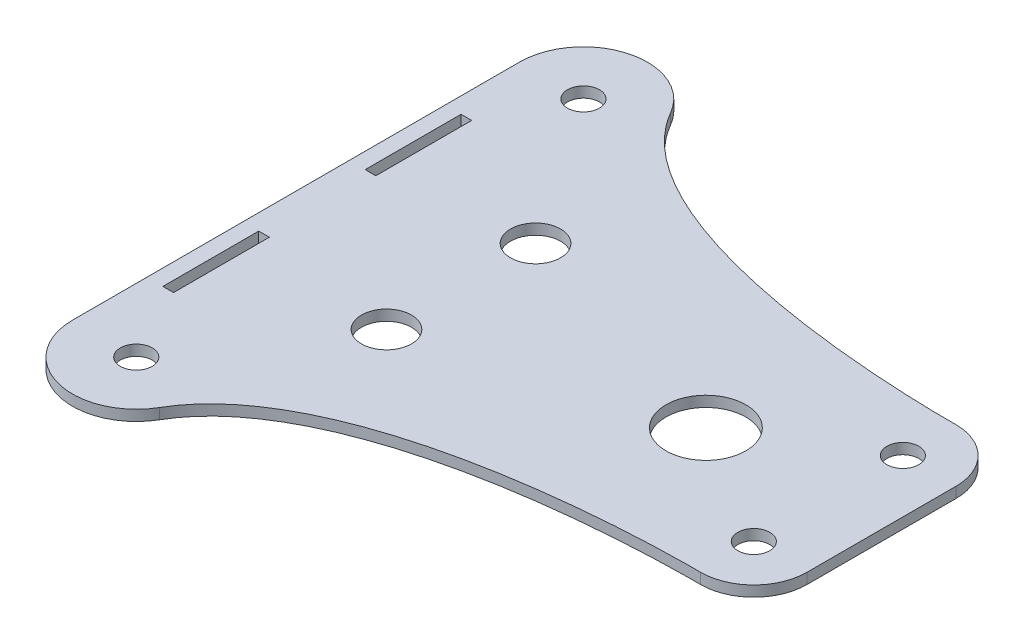
ISO-10303-21;
HEADER;
FILE_DESCRIPTION(('STEP AP214'),'2;1');
FILE_NAME('part.step','',(''),(''),'','','');
FILE_SCHEMA(('AUTOMOTIVE_DESIGN { 1 0 10303 214 1 1 1 1 }'));
ENDSEC;
DATA;
#1=APPLICATION_CONTEXT('core data for automotive mechanical design processes');
#2=APPLICATION_PROTOCOL_DEFINITION('international standard','automotive_design',2000,#1);
#3=PRODUCT_CONTEXT('',#1,'mechanical');
#4=PRODUCT('Part','Part','',(#3));
#5=PRODUCT_RELATED_PRODUCT_CATEGORY('part','',(#4));
#6=PRODUCT_DEFINITION_FORMATION('','',#4);
#7=PRODUCT_DEFINITION_CONTEXT('part definition',#1,'design');
#8=PRODUCT_DEFINITION('design','',#6,#7);
#9=PRODUCT_DEFINITION_SHAPE('','',#8);
#10=(LENGTH_UNIT() NAMED_UNIT(*) SI_UNIT(.MILLI.,.METRE.));
#11=(NAMED_UNIT(*) PLANE_ANGLE_UNIT() SI_UNIT($,.RADIAN.));
#12=(NAMED_UNIT(*) SI_UNIT($,.STERADIAN.) SOLID_ANGLE_UNIT());
#13=UNCERTAINTY_MEASURE_WITH_UNIT(LENGTH_MEASURE(1.E-05),#10,'distance_accuracy_value','');
#14=(GEOMETRIC_REPRESENTATION_CONTEXT(3) GLOBAL_UNCERTAINTY_ASSIGNED_CONTEXT((#13)) GLOBAL_UNIT_ASSIGNED_CONTEXT((#10,
#11,#12)) REPRESENTATION_CONTEXT('',''));
#15=CARTESIAN_POINT('',(0.,0.,0.));
#16=DIRECTION('',(0.,0.,1.));
#17=DIRECTION('',(1.,0.,0.));
#18=AXIS2_PLACEMENT_3D('',#15,#16,#17);
#19=CARTESIAN_POINT('',(353.145171412631,10.,-402.766363167062));
#20=DIRECTION('',(0.,-1.,0.));
#21=DIRECTION('',(0.,0.,-1.));
#22=AXIS2_PLACEMENT_3D('',#19,#20,#21);
#23=PLANE('',#22);
#24=DIRECTION('',(0.,0.,-1.));
#25=VECTOR('',#24,1.);
#26=CARTESIAN_POINT('',(44.9999999999999,10.,-410.));
#27=LINE('',#26,#25);
#28=CARTESIAN_POINT('',(44.9999999999999,10.,-320.));
#29=VERTEX_POINT('',#28);
#30=CARTESIAN_POINT('',(44.9999999999999,10.,-410.));
#31=VERTEX_POINT('',#30);
#32=EDGE_CURVE('E174',#29,#31,#27,.T.);
#33=ORIENTED_EDGE('',*,*,#32,.F.);
#34=DIRECTION('',(1.,0.,0.));
#35=VECTOR('',#34,1.);
#36=CARTESIAN_POINT('',(44.9999999999999,10.,-320.));
#37=LINE('',#36,#35);
#38=CARTESIAN_POINT('',(34.9999999999999,10.,-320.));
#39=VERTEX_POINT('',#38);
#40=EDGE_CURVE('E49',#39,#29,#37,.T.);
#41=ORIENTED_EDGE('',*,*,#40,.F.);
#42=DIRECTION('',(0.,0.,1.));
#43=VECTOR('',#42,1.);
#44=CARTESIAN_POINT('',(34.9999999999999,10.,-320.));
#45=LINE('',#44,#43);
#46=CARTESIAN_POINT('',(34.9999999999999,10.,-410.));
#47=VERTEX_POINT('',#46);
#48=EDGE_CURVE('E165',#47,#39,#45,.T.);
#49=ORIENTED_EDGE('',*,*,#48,.F.);
#50=DIRECTION('',(-1.,0.,0.));
#51=VECTOR('',#50,1.);
#52=CARTESIAN_POINT('',(34.9999999999999,10.,-410.));
#53=LINE('',#52,#51);
#54=EDGE_CURVE('E168',#31,#47,#53,.T.);
#55=ORIENTED_EDGE('',*,*,#54,.F.);
#56=EDGE_LOOP('',(#33,#41,#49,#55));
#57=FACE_BOUND('',#56,.T.);
#58=DIRECTION('',(1.,0.,0.));
#59=VECTOR('',#58,1.);
#60=CARTESIAN_POINT('',(34.9999999999999,10.,-130.));
#61=LINE('',#60,#59);
#62=CARTESIAN_POINT('',(34.9999999999999,10.,-130.));
#63=VERTEX_POINT('',#62);
#64=CARTESIAN_POINT('',(44.9999999999999,10.,-130.));
#65=VERTEX_POINT('',#64);
#66=EDGE_CURVE('E199',#63,#65,#61,.T.);
#67=ORIENTED_EDGE('',*,*,#66,.F.);
#68=DIRECTION('',(0.,0.,1.));
#69=VECTOR('',#68,1.);
#70=CARTESIAN_POINT('',(34.9999999999999,10.,-220.));
#71=LINE('',#70,#69);
#72=CARTESIAN_POINT('',(34.9999999999999,10.,-220.));
#73=VERTEX_POINT('',#72);
#74=EDGE_CURVE('E180',#73,#63,#71,.T.);
#75=ORIENTED_EDGE('',*,*,#74,.F.);
#76=DIRECTION('',(-1.,0.,0.));
#77=VECTOR('',#76,1.);
#78=CARTESIAN_POINT('',(44.9999999999999,10.,-220.));
#79=LINE('',#78,#77);
#80=CARTESIAN_POINT('',(44.9999999999999,10.,-220.));
#81=VERTEX_POINT('',#80);
#82=EDGE_CURVE('E188',#81,#73,#79,.T.);
#83=ORIENTED_EDGE('',*,*,#82,.F.);
#84=DIRECTION('',(0.,0.,-1.));
#85=VECTOR('',#84,1.);
#86=CARTESIAN_POINT('',(44.9999999999999,10.,-130.));
#87=LINE('',#86,#85);
#88=EDGE_CURVE('E202',#65,#81,#87,.T.);
#89=ORIENTED_EDGE('',*,*,#88,.F.);
#90=EDGE_LOOP('',(#67,#75,#83,#89));
#91=FACE_BOUND('',#90,.T.);
#92=CARTESIAN_POINT('',(175.,10.,-340.));
#93=DIRECTION('',(0.,1.,0.));
#94=DIRECTION('',(0.,0.,1.));
#95=AXIS2_PLACEMENT_3D('',#92,#93,#94);
#96=CIRCLE('',#95,23.5);
#97=CARTESIAN_POINT('',(175.,10.,-316.5));
#98=VERTEX_POINT('',#97);
#99=EDGE_CURVE('E222',#98,#98,#96,.T.);
#100=ORIENTED_EDGE('',*,*,#99,.F.);
#101=EDGE_LOOP('',(#100));
#102=FACE_BOUND('',#101,.T.);
#103=CARTESIAN_POINT('',(80.,10.,-480.));
#104=DIRECTION('',(0.,1.,0.));
#105=DIRECTION('',(0.,0.,1.));
#106=AXIS2_PLACEMENT_3D('',#103,#104,#105);
#107=CIRCLE('',#106,15.);
#108=CARTESIAN_POINT('',(80.,10.,-465.));
#109=VERTEX_POINT('',#108);
#110=EDGE_CURVE('E234',#109,#109,#107,.T.);
#111=ORIENTED_EDGE('',*,*,#110,.F.);
#112=EDGE_LOOP('',(#111));
#113=FACE_BOUND('',#112,.T.);
#114=CARTESIAN_POINT('',(520.,10.,-200.));
#115=DIRECTION('',(0.,1.,0.));
#116=DIRECTION('',(0.,0.,1.));
#117=AXIS2_PLACEMENT_3D('',#114,#115,#116);
#118=CIRCLE('',#117,15.0000000000001);
#119=CARTESIAN_POINT('',(520.,10.,-185.));
#120=VERTEX_POINT('',#119);
#121=EDGE_CURVE('E246',#120,#120,#118,.T.);
#122=ORIENTED_EDGE('',*,*,#121,.F.);
#123=EDGE_LOOP('',(#122));
#124=FACE_BOUND('',#123,.T.);
#125=CARTESIAN_POINT('',(520.,10.,-390.));
#126=CARTESIAN_POINT('',(519.671151051004,10.,-390.08025036953));
#127=CARTESIAN_POINT('',(204.728797973656,10.,-383.963384742635));
#128=CARTESIAN_POINT('',(131.961524227066,10.,-510.));
#129=B_SPLINE_CURVE_WITH_KNOTS('',3,(#125,#126,#127,#128),.UNSPECIFIED.,.F.,.F.,(4,4),(0.,1.),.UNSPECIFIED.);
#130=CARTESIAN_POINT('',(520.,10.,-390.));
#131=VERTEX_POINT('',#130);
#132=CARTESIAN_POINT('',(131.961524227066,10.,-510.));
#133=VERTEX_POINT('',#132);
#134=EDGE_CURVE('E257',#131,#133,#129,.T.);
#135=ORIENTED_EDGE('',*,*,#134,.T.);
#136=CARTESIAN_POINT('',(80.,10.,-480.));
#137=DIRECTION('',(0.,1.,0.));
#138=DIRECTION('',(0.,0.,1.));
#139=AXIS2_PLACEMENT_3D('',#136,#137,#138);
#140=CIRCLE('',#139,60.);
#141=CARTESIAN_POINT('',(20.,10.,-480.));
#142=VERTEX_POINT('',#141);
#143=EDGE_CURVE('E263',#133,#142,#140,.T.);
#144=ORIENTED_EDGE('',*,*,#143,.T.);
#145=DIRECTION('',(0.,0.,1.));
#146=VECTOR('',#145,1.);
#147=CARTESIAN_POINT('',(20.,10.,-480.));
#148=LINE('',#147,#146);
#149=CARTESIAN_POINT('',(19.9999999999999,10.,-60.));
#150=VERTEX_POINT('',#149);
#151=EDGE_CURVE('E269',#142,#150,#148,.T.);
#152=ORIENTED_EDGE('',*,*,#151,.T.);
#153=CARTESIAN_POINT('',(80.,10.,-60.));
#154=DIRECTION('',(0.,1.,0.));
#155=DIRECTION('',(0.,0.,1.));
#156=AXIS2_PLACEMENT_3D('',#153,#154,#155);
#157=CIRCLE('',#156,60.);
#158=CARTESIAN_POINT('',(131.961524227066,10.,-29.9999999999999));
#159=VERTEX_POINT('',#158);
#160=EDGE_CURVE('E271',#150,#159,#157,.T.);
#161=ORIENTED_EDGE('',*,*,#160,.T.);
#162=CARTESIAN_POINT('',(131.961524227066,10.,-29.9999999999999));
#163=CARTESIAN_POINT('',(204.728797973656,10.,-156.036615257365));
#164=CARTESIAN_POINT('',(519.671151051004,10.,-149.919749630471));
#165=CARTESIAN_POINT('',(520.,10.,-150.));
#166=B_SPLINE_CURVE_WITH_KNOTS('',3,(#162,#163,#164,#165),.UNSPECIFIED.,.F.,.F.,(4,4),(0.,1.),.UNSPECIFIED.);
#167=CARTESIAN_POINT('',(520.,10.,-150.));
#168=VERTEX_POINT('',#167);
#169=EDGE_CURVE('E273',#159,#168,#166,.T.);
#170=ORIENTED_EDGE('',*,*,#169,.T.);
#171=CARTESIAN_POINT('',(520.,10.,-200.));
#172=DIRECTION('',(0.,1.,0.));
#173=DIRECTION('',(0.,0.,1.));
#174=AXIS2_PLACEMENT_3D('',#171,#172,#173);
#175=CIRCLE('',#174,50.);
#176=CARTESIAN_POINT('',(570.,10.,-200.));
#177=VERTEX_POINT('',#176);
#178=EDGE_CURVE('E278',#168,#177,#175,.T.);
#179=ORIENTED_EDGE('',*,*,#178,.T.);
#180=DIRECTION('',(0.,0.,-1.));
#181=VECTOR('',#180,1.);
#182=CARTESIAN_POINT('',(570.,10.,-340.));
#183=LINE('',#182,#181);
#184=CARTESIAN_POINT('',(570.,10.,-340.));
#185=VERTEX_POINT('',#184);
#186=EDGE_CURVE('E399',#177,#185,#183,.T.);
#187=ORIENTED_EDGE('',*,*,#186,.T.);
#188=CARTESIAN_POINT('',(520.,10.,-340.));
#189=DIRECTION('',(0.,1.,0.));
#190=DIRECTION('',(0.,0.,-1.));
#191=AXIS2_PLACEMENT_3D('',#188,#189,#190);
#192=CIRCLE('',#191,50.);
#193=EDGE_CURVE('E344',#185,#131,#192,.T.);
#194=ORIENTED_EDGE('',*,*,#193,.T.);
#195=EDGE_LOOP('',(#135,#144,#152,#161,#170,#179,#187,#194));
#196=FACE_BOUND('',#195,.T.);
#197=CARTESIAN_POINT('',(405.,10.,-270.));
#198=DIRECTION('',(0.,1.,0.));
#199=DIRECTION('',(0.,0.,1.));
#200=AXIS2_PLACEMENT_3D('',#197,#198,#199);
#201=CIRCLE('',#200,37.5);
#202=CARTESIAN_POINT('',(405.,10.,-232.5));
#203=VERTEX_POINT('',#202);
#204=EDGE_CURVE('E252',#203,#203,#201,.T.);
#205=ORIENTED_EDGE('',*,*,#204,.F.);
#206=EDGE_LOOP('',(#205));
#207=FACE_BOUND('',#206,.T.);
#208=CARTESIAN_POINT('',(520.,10.,-340.));
#209=DIRECTION('',(0.,1.,0.));
#210=DIRECTION('',(0.,0.,1.));
#211=AXIS2_PLACEMENT_3D('',#208,#209,#210);
#212=CIRCLE('',#211,15.);
#213=CARTESIAN_POINT('',(520.,10.,-325.));
#214=VERTEX_POINT('',#213);
#215=EDGE_CURVE('E240',#214,#214,#212,.T.);
#216=ORIENTED_EDGE('',*,*,#215,.F.);
#217=EDGE_LOOP('',(#216));
#218=FACE_BOUND('',#217,.T.);
#219=CARTESIAN_POINT('',(80.,10.,-60.));
#220=DIRECTION('',(0.,1.,0.));
#221=DIRECTION('',(0.,0.,1.));
#222=AXIS2_PLACEMENT_3D('',#219,#220,#221);
#223=CIRCLE('',#222,15.);
#224=CARTESIAN_POINT('',(80.,10.,-45.));
#225=VERTEX_POINT('',#224);
#226=EDGE_CURVE('E228',#225,#225,#223,.T.);
#227=ORIENTED_EDGE('',*,*,#226,.F.);
#228=EDGE_LOOP('',(#227));
#229=FACE_BOUND('',#228,.T.);
#230=CARTESIAN_POINT('',(175.,10.,-200.));
#231=DIRECTION('',(0.,1.,0.));
#232=DIRECTION('',(0.,0.,1.));
#233=AXIS2_PLACEMENT_3D('',#230,#231,#232);
#234=CIRCLE('',#233,23.5);
#235=CARTESIAN_POINT('',(175.,10.,-176.5));
#236=VERTEX_POINT('',#235);
#237=EDGE_CURVE('E216',#236,#236,#234,.T.);
#238=ORIENTED_EDGE('',*,*,#237,.F.);
#239=EDGE_LOOP('',(#238));
#240=FACE_BOUND('',#239,.T.);
#241=ADVANCED_FACE('F33',(#57,#91,#102,#113,#124,#196,#207,#218,#229,#240),#23,.F.);
#242=CARTESIAN_POINT('',(353.145171412631,0.,-402.766363167062));
#243=DIRECTION('',(0.,-1.,0.));
#244=DIRECTION('',(0.,0.,-1.));
#245=AXIS2_PLACEMENT_3D('',#242,#243,#244);
#246=PLANE('',#245);
#247=DIRECTION('',(1.,0.,0.));
#248=VECTOR('',#247,1.);
#249=CARTESIAN_POINT('',(44.9999999999999,0.,-320.));
#250=LINE('',#249,#248);
#251=CARTESIAN_POINT('',(34.9999999999999,0.,-320.));
#252=VERTEX_POINT('',#251);
#253=CARTESIAN_POINT('',(44.9999999999999,0.,-320.));
#254=VERTEX_POINT('',#253);
#255=EDGE_CURVE('E149',#252,#254,#250,.T.);
#256=ORIENTED_EDGE('',*,*,#255,.T.);
#257=DIRECTION('',(0.,0.,-1.));
#258=VECTOR('',#257,1.);
#259=CARTESIAN_POINT('',(44.9999999999999,0.,-410.));
#260=LINE('',#259,#258);
#261=CARTESIAN_POINT('',(44.9999999999999,0.,-410.));
#262=VERTEX_POINT('',#261);
#263=EDGE_CURVE('E158',#254,#262,#260,.T.);
#264=ORIENTED_EDGE('',*,*,#263,.T.);
#265=DIRECTION('',(-1.,0.,0.));
#266=VECTOR('',#265,1.);
#267=CARTESIAN_POINT('',(34.9999999999999,0.,-410.));
#268=LINE('',#267,#266);
#269=CARTESIAN_POINT('',(34.9999999999999,0.,-410.));
#270=VERTEX_POINT('',#269);
#271=EDGE_CURVE('E57',#262,#270,#268,.T.);
#272=ORIENTED_EDGE('',*,*,#271,.T.);
#273=DIRECTION('',(0.,0.,1.));
#274=VECTOR('',#273,1.);
#275=CARTESIAN_POINT('',(34.9999999999999,0.,-320.));
#276=LINE('',#275,#274);
#277=EDGE_CURVE('E155',#270,#252,#276,.T.);
#278=ORIENTED_EDGE('',*,*,#277,.T.);
#279=EDGE_LOOP('',(#256,#264,#272,#278));
#280=FACE_BOUND('',#279,.T.);
#281=DIRECTION('',(0.,0.,1.));
#282=VECTOR('',#281,1.);
#283=CARTESIAN_POINT('',(34.9999999999999,0.,-220.));
#284=LINE('',#283,#282);
#285=CARTESIAN_POINT('',(34.9999999999999,0.,-220.));
#286=VERTEX_POINT('',#285);
#287=CARTESIAN_POINT('',(34.9999999999999,0.,-130.));
#288=VERTEX_POINT('',#287);
#289=EDGE_CURVE('E184',#286,#288,#284,.T.);
#290=ORIENTED_EDGE('',*,*,#289,.T.);
#291=DIRECTION('',(1.,0.,0.));
#292=VECTOR('',#291,1.);
#293=CARTESIAN_POINT('',(34.9999999999999,0.,-130.));
#294=LINE('',#293,#292);
#295=CARTESIAN_POINT('',(45.,0.,-130.));
#296=VERTEX_POINT('',#295);
#297=EDGE_CURVE('E187',#288,#296,#294,.T.);
#298=ORIENTED_EDGE('',*,*,#297,.T.);
#299=DIRECTION('',(0.,0.,-1.));
#300=VECTOR('',#299,1.);
#301=CARTESIAN_POINT('',(44.9999999999999,0.,-130.));
#302=LINE('',#301,#300);
#303=CARTESIAN_POINT('',(44.9999999999999,0.,-220.));
#304=VERTEX_POINT('',#303);
#305=EDGE_CURVE('E191',#296,#304,#302,.T.);
#306=ORIENTED_EDGE('',*,*,#305,.T.);
#307=DIRECTION('',(-1.,0.,0.));
#308=VECTOR('',#307,1.);
#309=CARTESIAN_POINT('',(44.9999999999999,0.,-220.));
#310=LINE('',#309,#308);
#311=EDGE_CURVE('E194',#304,#286,#310,.T.);
#312=ORIENTED_EDGE('',*,*,#311,.T.);
#313=EDGE_LOOP('',(#290,#298,#306,#312));
#314=FACE_BOUND('',#313,.T.);
#315=CARTESIAN_POINT('',(175.,0.,-340.));
#316=DIRECTION('',(0.,1.,0.));
#317=DIRECTION('',(0.,0.,1.));
#318=AXIS2_PLACEMENT_3D('',#315,#316,#317);
#319=CIRCLE('',#318,23.5);
#320=CARTESIAN_POINT('',(175.,0.,-316.5));
#321=VERTEX_POINT('',#320);
#322=EDGE_CURVE('E219',#321,#321,#319,.T.);
#323=ORIENTED_EDGE('',*,*,#322,.T.);
#324=EDGE_LOOP('',(#323));
#325=FACE_BOUND('',#324,.T.);
#326=CARTESIAN_POINT('',(80.,0.,-480.));
#327=DIRECTION('',(0.,1.,0.));
#328=DIRECTION('',(0.,0.,1.));
#329=AXIS2_PLACEMENT_3D('',#326,#327,#328);
#330=CIRCLE('',#329,15.);
#331=CARTESIAN_POINT('',(80.,0.,-465.));
#332=VERTEX_POINT('',#331);
#333=EDGE_CURVE('E231',#332,#332,#330,.T.);
#334=ORIENTED_EDGE('',*,*,#333,.T.);
#335=EDGE_LOOP('',(#334));
#336=FACE_BOUND('',#335,.T.);
#337=CARTESIAN_POINT('',(520.,0.,-200.));
#338=DIRECTION('',(0.,1.,0.));
#339=DIRECTION('',(0.,0.,1.));
#340=AXIS2_PLACEMENT_3D('',#337,#338,#339);
#341=CIRCLE('',#340,15.0000000000001);
#342=CARTESIAN_POINT('',(520.,0.,-185.));
#343=VERTEX_POINT('',#342);
#344=EDGE_CURVE('E243',#343,#343,#341,.T.);
#345=ORIENTED_EDGE('',*,*,#344,.T.);
#346=EDGE_LOOP('',(#345));
#347=FACE_BOUND('',#346,.T.);
#348=CARTESIAN_POINT('',(520.,0.,-390.));
#349=CARTESIAN_POINT('',(519.671151051004,0.,-390.08025036953));
#350=CARTESIAN_POINT('',(204.728797973656,0.,-383.963384742635));
#351=CARTESIAN_POINT('',(131.961524227066,0.,-510.));
#352=B_SPLINE_CURVE_WITH_KNOTS('',3,(#348,#349,#350,#351),.UNSPECIFIED.,.F.,.F.,(4,4),(0.,1.),.UNSPECIFIED.);
#353=CARTESIAN_POINT('',(520.,0.,-390.));
#354=VERTEX_POINT('',#353);
#355=CARTESIAN_POINT('',(131.961524227066,0.,-510.));
#356=VERTEX_POINT('',#355);
#357=EDGE_CURVE('E255',#354,#356,#352,.T.);
#358=ORIENTED_EDGE('',*,*,#357,.F.);
#359=CARTESIAN_POINT('',(520.,0.,-340.));
#360=DIRECTION('',(0.,1.,0.));
#361=DIRECTION('',(0.,0.,-1.));
#362=AXIS2_PLACEMENT_3D('',#359,#360,#361);
#363=CIRCLE('',#362,50.);
#364=CARTESIAN_POINT('',(570.,0.,-340.));
#365=VERTEX_POINT('',#364);
#366=EDGE_CURVE('E264',#365,#354,#363,.T.);
#367=ORIENTED_EDGE('',*,*,#366,.F.);
#368=DIRECTION('',(0.,0.,-1.));
#369=VECTOR('',#368,1.);
#370=CARTESIAN_POINT('',(570.,0.,-340.));
#371=LINE('',#370,#369);
#372=CARTESIAN_POINT('',(570.,0.,-200.));
#373=VERTEX_POINT('',#372);
#374=EDGE_CURVE('E330',#373,#365,#371,.T.);
#375=ORIENTED_EDGE('',*,*,#374,.F.);
#376=CARTESIAN_POINT('',(520.,0.,-200.));
#377=DIRECTION('',(0.,1.,0.));
#378=DIRECTION('',(0.,0.,1.));
#379=AXIS2_PLACEMENT_3D('',#376,#377,#378);
#380=CIRCLE('',#379,50.);
#381=CARTESIAN_POINT('',(520.,0.,-150.));
#382=VERTEX_POINT('',#381);
#383=EDGE_CURVE('E340',#382,#373,#380,.T.);
#384=ORIENTED_EDGE('',*,*,#383,.F.);
#385=CARTESIAN_POINT('',(131.961524227066,0.,-29.9999999999999));
#386=CARTESIAN_POINT('',(204.728797973656,0.,-156.036615257365));
#387=CARTESIAN_POINT('',(519.671151051004,0.,-149.919749630471));
#388=CARTESIAN_POINT('',(520.,0.,-150.));
#389=B_SPLINE_CURVE_WITH_KNOTS('',3,(#385,#386,#387,#388),.UNSPECIFIED.,.F.,.F.,(4,4),(0.,1.),.UNSPECIFIED.);
#390=CARTESIAN_POINT('',(131.961524227066,0.,-29.9999999999999));
#391=VERTEX_POINT('',#390);
#392=EDGE_CURVE('E374',#391,#382,#389,.T.);
#393=ORIENTED_EDGE('',*,*,#392,.F.);
#394=CARTESIAN_POINT('',(80.,0.,-60.));
#395=DIRECTION('',(0.,1.,0.));
#396=DIRECTION('',(0.,0.,1.));
#397=AXIS2_PLACEMENT_3D('',#394,#395,#396);
#398=CIRCLE('',#397,60.);
#399=CARTESIAN_POINT('',(19.9999999999999,0.,-60.));
#400=VERTEX_POINT('',#399);
#401=EDGE_CURVE('E372',#400,#391,#398,.T.);
#402=ORIENTED_EDGE('',*,*,#401,.F.);
#403=DIRECTION('',(0.,0.,1.));
#404=VECTOR('',#403,1.);
#405=CARTESIAN_POINT('',(20.,0.,-480.));
#406=LINE('',#405,#404);
#407=CARTESIAN_POINT('',(20.,0.,-480.));
#408=VERTEX_POINT('',#407);
#409=EDGE_CURVE('E368',#408,#400,#406,.T.);
#410=ORIENTED_EDGE('',*,*,#409,.F.);
#411=CARTESIAN_POINT('',(80.,0.,-480.));
#412=DIRECTION('',(0.,1.,0.));
#413=DIRECTION('',(0.,0.,1.));
#414=AXIS2_PLACEMENT_3D('',#411,#412,#413);
#415=CIRCLE('',#414,60.);
#416=EDGE_CURVE('E370',#356,#408,#415,.T.);
#417=ORIENTED_EDGE('',*,*,#416,.F.);
#418=EDGE_LOOP('',(#358,#367,#375,#384,#393,#402,#410,#417));
#419=FACE_BOUND('',#418,.T.);
#420=CARTESIAN_POINT('',(405.,0.,-270.));
#421=DIRECTION('',(0.,1.,0.));
#422=DIRECTION('',(0.,0.,1.));
#423=AXIS2_PLACEMENT_3D('',#420,#421,#422);
#424=CIRCLE('',#423,37.5);
#425=CARTESIAN_POINT('',(405.,0.,-232.5));
#426=VERTEX_POINT('',#425);
#427=EDGE_CURVE('E249',#426,#426,#424,.T.);
#428=ORIENTED_EDGE('',*,*,#427,.T.);
#429=EDGE_LOOP('',(#428));
#430=FACE_BOUND('',#429,.T.);
#431=CARTESIAN_POINT('',(520.,0.,-340.));
#432=DIRECTION('',(0.,1.,0.));
#433=DIRECTION('',(0.,0.,1.));
#434=AXIS2_PLACEMENT_3D('',#431,#432,#433);
#435=CIRCLE('',#434,15.);
#436=CARTESIAN_POINT('',(520.,0.,-325.));
#437=VERTEX_POINT('',#436);
#438=EDGE_CURVE('E237',#437,#437,#435,.T.);
#439=ORIENTED_EDGE('',*,*,#438,.T.);
#440=EDGE_LOOP('',(#439));
#441=FACE_BOUND('',#440,.T.);
#442=CARTESIAN_POINT('',(80.,0.,-60.));
#443=DIRECTION('',(0.,1.,0.));
#444=DIRECTION('',(0.,0.,1.));
#445=AXIS2_PLACEMENT_3D('',#442,#443,#444);
#446=CIRCLE('',#445,15.);
#447=CARTESIAN_POINT('',(80.,0.,-45.));
#448=VERTEX_POINT('',#447);
#449=EDGE_CURVE('E225',#448,#448,#446,.T.);
#450=ORIENTED_EDGE('',*,*,#449,.T.);
#451=EDGE_LOOP('',(#450));
#452=FACE_BOUND('',#451,.T.);
#453=CARTESIAN_POINT('',(175.,0.,-200.));
#454=DIRECTION('',(0.,1.,0.));
#455=DIRECTION('',(0.,0.,1.));
#456=AXIS2_PLACEMENT_3D('',#453,#454,#455);
#457=CIRCLE('',#456,23.5);
#458=CARTESIAN_POINT('',(175.,0.,-176.5));
#459=VERTEX_POINT('',#458);
#460=EDGE_CURVE('E209',#459,#459,#457,.T.);
#461=ORIENTED_EDGE('',*,*,#460,.T.);
#462=EDGE_LOOP('',(#461));
#463=FACE_BOUND('',#462,.T.);
#464=ADVANCED_FACE('F162',(#280,#314,#325,#336,#347,#419,#430,#441,#452,#463),#246,.T.);
#465=DIRECTION('',(0.,-1.,0.));
#466=VECTOR('',#465,1.);
#467=SURFACE_OF_LINEAR_EXTRUSION('',#129,#466);
#468=ORIENTED_EDGE('',*,*,#357,.T.);
#469=DIRECTION('',(0.,-1.,0.));
#470=VECTOR('',#469,1.);
#471=CARTESIAN_POINT('',(131.961524227066,10.,-510.));
#472=LINE('',#471,#470);
#473=EDGE_CURVE('E11',#133,#356,#472,.T.);
#474=ORIENTED_EDGE('',*,*,#473,.F.);
#475=ORIENTED_EDGE('',*,*,#134,.F.);
#476=DIRECTION('',(0.,-1.,0.));
#477=VECTOR('',#476,1.);
#478=CARTESIAN_POINT('',(520.,10.,-390.));
#479=LINE('',#478,#477);
#480=EDGE_CURVE('E345',#131,#354,#479,.T.);
#481=ORIENTED_EDGE('',*,*,#480,.T.);
#482=EDGE_LOOP('',(#468,#474,#475,#481));
#483=FACE_BOUND('',#482,.T.);
#484=ADVANCED_FACE('F35',(#483),#467,.F.);
#485=CARTESIAN_POINT('',(80.,10.,-480.));
#486=DIRECTION('',(0.,-1.,0.));
#487=DIRECTION('',(0.,0.,-1.));
#488=AXIS2_PLACEMENT_3D('',#485,#486,#487);
#489=CYLINDRICAL_SURFACE('',#488,60.);
#490=ORIENTED_EDGE('',*,*,#416,.T.);
#491=DIRECTION('',(0.,-1.,0.));
#492=VECTOR('',#491,1.);
#493=CARTESIAN_POINT('',(20.,10.,-480.));
#494=LINE('',#493,#492);
#495=EDGE_CURVE('E42',#142,#408,#494,.T.);
#496=ORIENTED_EDGE('',*,*,#495,.F.);
#497=ORIENTED_EDGE('',*,*,#143,.F.);
#498=ORIENTED_EDGE('',*,*,#473,.T.);
#499=EDGE_LOOP('',(#490,#496,#497,#498));
#500=FACE_BOUND('',#499,.T.);
#501=ADVANCED_FACE('F297',(#500),#489,.T.);
#502=CARTESIAN_POINT('',(20.,10.,-480.));
#503=DIRECTION('',(1.,0.,0.));
#504=DIRECTION('',(0.,0.,-1.));
#505=AXIS2_PLACEMENT_3D('',#502,#503,#504);
#506=PLANE('',#505);
#507=ORIENTED_EDGE('',*,*,#409,.T.);
#508=DIRECTION('',(0.,-1.,0.));
#509=VECTOR('',#508,1.);
#510=CARTESIAN_POINT('',(19.9999999999999,10.,-60.));
#511=LINE('',#510,#509);
#512=EDGE_CURVE('E361',#150,#400,#511,.T.);
#513=ORIENTED_EDGE('',*,*,#512,.F.);
#514=ORIENTED_EDGE('',*,*,#151,.F.);
#515=ORIENTED_EDGE('',*,*,#495,.T.);
#516=EDGE_LOOP('',(#507,#513,#514,#515));
#517=FACE_BOUND('',#516,.T.);
#518=ADVANCED_FACE('F294',(#517),#506,.F.);
#519=CARTESIAN_POINT('',(80.,10.,-60.));
#520=DIRECTION('',(0.,-1.,0.));
#521=DIRECTION('',(0.,0.,-1.));
#522=AXIS2_PLACEMENT_3D('',#519,#520,#521);
#523=CYLINDRICAL_SURFACE('',#522,60.);
#524=ORIENTED_EDGE('',*,*,#401,.T.);
#525=DIRECTION('',(0.,-1.,0.));
#526=VECTOR('',#525,1.);
#527=CARTESIAN_POINT('',(131.961524227066,10.,-29.9999999999999));
#528=LINE('',#527,#526);
#529=EDGE_CURVE('E358',#159,#391,#528,.T.);
#530=ORIENTED_EDGE('',*,*,#529,.F.);
#531=ORIENTED_EDGE('',*,*,#160,.F.);
#532=ORIENTED_EDGE('',*,*,#512,.T.);
#533=EDGE_LOOP('',(#524,#530,#531,#532));
#534=FACE_BOUND('',#533,.T.);
#535=ADVANCED_FACE('F289',(#534),#523,.T.);
#536=DIRECTION('',(0.,-1.,0.));
#537=VECTOR('',#536,1.);
#538=SURFACE_OF_LINEAR_EXTRUSION('',#166,#537);
#539=ORIENTED_EDGE('',*,*,#392,.T.);
#540=DIRECTION('',(0.,-1.,0.));
#541=VECTOR('',#540,1.);
#542=CARTESIAN_POINT('',(520.,10.,-150.));
#543=LINE('',#542,#541);
#544=EDGE_CURVE('E355',#168,#382,#543,.T.);
#545=ORIENTED_EDGE('',*,*,#544,.F.);
#546=ORIENTED_EDGE('',*,*,#169,.F.);
#547=ORIENTED_EDGE('',*,*,#529,.T.);
#548=EDGE_LOOP('',(#539,#545,#546,#547));
#549=FACE_BOUND('',#548,.T.);
#550=ADVANCED_FACE('F284',(#549),#538,.F.);
#551=CARTESIAN_POINT('',(520.,10.,-200.));
#552=DIRECTION('',(0.,-1.,0.));
#553=DIRECTION('',(0.,0.,-1.));
#554=AXIS2_PLACEMENT_3D('',#551,#552,#553);
#555=CYLINDRICAL_SURFACE('',#554,50.);
#556=ORIENTED_EDGE('',*,*,#383,.T.);
#557=DIRECTION('',(0.,-1.,0.));
#558=VECTOR('',#557,1.);
#559=CARTESIAN_POINT('',(570.,10.,-200.));
#560=LINE('',#559,#558);
#561=EDGE_CURVE('E336',#177,#373,#560,.T.);
#562=ORIENTED_EDGE('',*,*,#561,.F.);
#563=ORIENTED_EDGE('',*,*,#178,.F.);
#564=ORIENTED_EDGE('',*,*,#544,.T.);
#565=EDGE_LOOP('',(#556,#562,#563,#564));
#566=FACE_BOUND('',#565,.T.);
#567=ADVANCED_FACE('F288',(#566),#555,.T.);
#568=CARTESIAN_POINT('',(570.,10.,-340.));
#569=DIRECTION('',(-1.,0.,0.));
#570=DIRECTION('',(0.,0.,1.));
#571=AXIS2_PLACEMENT_3D('',#568,#569,#570);
#572=PLANE('',#571);
#573=ORIENTED_EDGE('',*,*,#374,.T.);
#574=DIRECTION('',(0.,-1.,0.));
#575=VECTOR('',#574,1.);
#576=CARTESIAN_POINT('',(570.,10.,-340.));
#577=LINE('',#576,#575);
#578=EDGE_CURVE('E333',#185,#365,#577,.T.);
#579=ORIENTED_EDGE('',*,*,#578,.F.);
#580=ORIENTED_EDGE('',*,*,#186,.F.);
#581=ORIENTED_EDGE('',*,*,#561,.T.);
#582=EDGE_LOOP('',(#573,#579,#580,#581));
#583=FACE_BOUND('',#582,.T.);
#584=ADVANCED_FACE('F319',(#583),#572,.F.);
#585=CARTESIAN_POINT('',(520.,10.,-340.));
#586=DIRECTION('',(0.,-1.,0.));
#587=DIRECTION('',(0.,0.,-1.));
#588=AXIS2_PLACEMENT_3D('',#585,#586,#587);
#589=CYLINDRICAL_SURFACE('',#588,50.);
#590=ORIENTED_EDGE('',*,*,#366,.T.);
#591=ORIENTED_EDGE('',*,*,#480,.F.);
#592=ORIENTED_EDGE('',*,*,#193,.F.);
#593=ORIENTED_EDGE('',*,*,#578,.T.);
#594=EDGE_LOOP('',(#590,#591,#592,#593));
#595=FACE_BOUND('',#594,.T.);
#596=ADVANCED_FACE('F317',(#595),#589,.T.);
#597=CARTESIAN_POINT('',(405.,10.,-270.));
#598=DIRECTION('',(0.,-1.,0.));
#599=DIRECTION('',(0.,0.,-1.));
#600=AXIS2_PLACEMENT_3D('',#597,#598,#599);
#601=CYLINDRICAL_SURFACE('',#600,37.5);
#602=ORIENTED_EDGE('',*,*,#204,.T.);
#603=EDGE_LOOP('',(#602));
#604=FACE_BOUND('',#603,.T.);
#605=ORIENTED_EDGE('',*,*,#427,.F.);
#606=EDGE_LOOP('',(#605));
#607=FACE_BOUND('',#606,.T.);
#608=ADVANCED_FACE('F314',(#604,#607),#601,.F.);
#609=CARTESIAN_POINT('',(520.,10.,-200.));
#610=DIRECTION('',(0.,-1.,0.));
#611=DIRECTION('',(0.,0.,-1.));
#612=AXIS2_PLACEMENT_3D('',#609,#610,#611);
#613=CYLINDRICAL_SURFACE('',#612,15.0000000000001);
#614=ORIENTED_EDGE('',*,*,#121,.T.);
#615=EDGE_LOOP('',(#614));
#616=FACE_BOUND('',#615,.T.);
#617=ORIENTED_EDGE('',*,*,#344,.F.);
#618=EDGE_LOOP('',(#617));
#619=FACE_BOUND('',#618,.T.);
#620=ADVANCED_FACE('F437',(#616,#619),#613,.F.);
#621=CARTESIAN_POINT('',(520.,10.,-340.));
#622=DIRECTION('',(0.,-1.,0.));
#623=DIRECTION('',(0.,0.,-1.));
#624=AXIS2_PLACEMENT_3D('',#621,#622,#623);
#625=CYLINDRICAL_SURFACE('',#624,15.);
#626=ORIENTED_EDGE('',*,*,#215,.T.);
#627=EDGE_LOOP('',(#626));
#628=FACE_BOUND('',#627,.T.);
#629=ORIENTED_EDGE('',*,*,#438,.F.);
#630=EDGE_LOOP('',(#629));
#631=FACE_BOUND('',#630,.T.);
#632=ADVANCED_FACE('F434',(#628,#631),#625,.F.);
#633=CARTESIAN_POINT('',(80.,10.,-480.));
#634=DIRECTION('',(0.,-1.,0.));
#635=DIRECTION('',(0.,0.,-1.));
#636=AXIS2_PLACEMENT_3D('',#633,#634,#635);
#637=CYLINDRICAL_SURFACE('',#636,15.);
#638=ORIENTED_EDGE('',*,*,#110,.T.);
#639=EDGE_LOOP('',(#638));
#640=FACE_BOUND('',#639,.T.);
#641=ORIENTED_EDGE('',*,*,#333,.F.);
#642=EDGE_LOOP('',(#641));
#643=FACE_BOUND('',#642,.T.);
#644=ADVANCED_FACE('F430',(#640,#643),#637,.F.);
#645=CARTESIAN_POINT('',(80.,10.,-60.));
#646=DIRECTION('',(0.,-1.,0.));
#647=DIRECTION('',(0.,0.,-1.));
#648=AXIS2_PLACEMENT_3D('',#645,#646,#647);
#649=CYLINDRICAL_SURFACE('',#648,15.);
#650=ORIENTED_EDGE('',*,*,#226,.T.);
#651=EDGE_LOOP('',(#650));
#652=FACE_BOUND('',#651,.T.);
#653=ORIENTED_EDGE('',*,*,#449,.F.);
#654=EDGE_LOOP('',(#653));
#655=FACE_BOUND('',#654,.T.);
#656=ADVANCED_FACE('F423',(#652,#655),#649,.F.);
#657=CARTESIAN_POINT('',(175.,10.,-340.));
#658=DIRECTION('',(0.,-1.,0.));
#659=DIRECTION('',(0.,0.,-1.));
#660=AXIS2_PLACEMENT_3D('',#657,#658,#659);
#661=CYLINDRICAL_SURFACE('',#660,23.5);
#662=ORIENTED_EDGE('',*,*,#99,.T.);
#663=EDGE_LOOP('',(#662));
#664=FACE_BOUND('',#663,.T.);
#665=ORIENTED_EDGE('',*,*,#322,.F.);
#666=EDGE_LOOP('',(#665));
#667=FACE_BOUND('',#666,.T.);
#668=ADVANCED_FACE('F412',(#664,#667),#661,.F.);
#669=CARTESIAN_POINT('',(175.,10.,-200.));
#670=DIRECTION('',(0.,-1.,0.));
#671=DIRECTION('',(0.,0.,-1.));
#672=AXIS2_PLACEMENT_3D('',#669,#670,#671);
#673=CYLINDRICAL_SURFACE('',#672,23.5);
#674=ORIENTED_EDGE('',*,*,#237,.T.);
#675=EDGE_LOOP('',(#674));
#676=FACE_BOUND('',#675,.T.);
#677=ORIENTED_EDGE('',*,*,#460,.F.);
#678=EDGE_LOOP('',(#677));
#679=FACE_BOUND('',#678,.T.);
#680=ADVANCED_FACE('F408',(#676,#679),#673,.F.);
#681=CARTESIAN_POINT('',(34.9999999999999,0.,-220.));
#682=DIRECTION('',(-1.,0.,0.));
#683=DIRECTION('',(0.,0.,1.));
#684=AXIS2_PLACEMENT_3D('',#681,#682,#683);
#685=PLANE('',#684);
#686=ORIENTED_EDGE('',*,*,#74,.T.);
#687=DIRECTION('',(0.,1.,0.));
#688=VECTOR('',#687,1.);
#689=CARTESIAN_POINT('',(34.9999999999999,0.,-130.));
#690=LINE('',#689,#688);
#691=EDGE_CURVE('E197',#288,#63,#690,.T.);
#692=ORIENTED_EDGE('',*,*,#691,.F.);
#693=ORIENTED_EDGE('',*,*,#289,.F.);
#694=DIRECTION('',(0.,1.,0.));
#695=VECTOR('',#694,1.);
#696=CARTESIAN_POINT('',(34.9999999999999,0.,-220.));
#697=LINE('',#696,#695);
#698=EDGE_CURVE('E207',#286,#73,#697,.T.);
#699=ORIENTED_EDGE('',*,*,#698,.T.);
#700=EDGE_LOOP('',(#686,#692,#693,#699));
#701=FACE_BOUND('',#700,.T.);
#702=ADVANCED_FACE('F411',(#701),#685,.F.);
#703=CARTESIAN_POINT('',(44.9999999999999,0.,-220.));
#704=DIRECTION('',(0.,0.,-1.));
#705=DIRECTION('',(-1.,0.,0.));
#706=AXIS2_PLACEMENT_3D('',#703,#704,#705);
#707=PLANE('',#706);
#708=ORIENTED_EDGE('',*,*,#82,.T.);
#709=ORIENTED_EDGE('',*,*,#698,.F.);
#710=ORIENTED_EDGE('',*,*,#311,.F.);
#711=DIRECTION('',(0.,1.,0.));
#712=VECTOR('',#711,1.);
#713=CARTESIAN_POINT('',(44.9999999999999,0.,-220.));
#714=LINE('',#713,#712);
#715=EDGE_CURVE('E210',#304,#81,#714,.T.);
#716=ORIENTED_EDGE('',*,*,#715,.T.);
#717=EDGE_LOOP('',(#708,#709,#710,#716));
#718=FACE_BOUND('',#717,.T.);
#719=ADVANCED_FACE('F420',(#718),#707,.F.);
#720=CARTESIAN_POINT('',(44.9999999999999,0.,-130.));
#721=DIRECTION('',(1.,0.,0.));
#722=DIRECTION('',(0.,0.,-1.));
#723=AXIS2_PLACEMENT_3D('',#720,#721,#722);
#724=PLANE('',#723);
#725=ORIENTED_EDGE('',*,*,#88,.T.);
#726=ORIENTED_EDGE('',*,*,#715,.F.);
#727=ORIENTED_EDGE('',*,*,#305,.F.);
#728=DIRECTION('',(0.,1.,0.));
#729=VECTOR('',#728,1.);
#730=CARTESIAN_POINT('',(44.9999999999999,0.,-130.));
#731=LINE('',#730,#729);
#732=EDGE_CURVE('E212',#296,#65,#731,.T.);
#733=ORIENTED_EDGE('',*,*,#732,.T.);
#734=EDGE_LOOP('',(#725,#726,#727,#733));
#735=FACE_BOUND('',#734,.T.);
#736=ADVANCED_FACE('F526',(#735),#724,.F.);
#737=CARTESIAN_POINT('',(34.9999999999999,0.,-130.));
#738=DIRECTION('',(0.,0.,1.));
#739=DIRECTION('',(1.,0.,0.));
#740=AXIS2_PLACEMENT_3D('',#737,#738,#739);
#741=PLANE('',#740);
#742=ORIENTED_EDGE('',*,*,#66,.T.);
#743=ORIENTED_EDGE('',*,*,#732,.F.);
#744=ORIENTED_EDGE('',*,*,#297,.F.);
#745=ORIENTED_EDGE('',*,*,#691,.T.);
#746=EDGE_LOOP('',(#742,#743,#744,#745));
#747=FACE_BOUND('',#746,.T.);
#748=ADVANCED_FACE('F536',(#747),#741,.F.);
#749=CARTESIAN_POINT('',(44.9999999999999,0.,-320.));
#750=DIRECTION('',(0.,0.,1.));
#751=DIRECTION('',(1.,0.,0.));
#752=AXIS2_PLACEMENT_3D('',#749,#750,#751);
#753=PLANE('',#752);
#754=ORIENTED_EDGE('',*,*,#40,.T.);
#755=DIRECTION('',(0.,1.,0.));
#756=VECTOR('',#755,1.);
#757=CARTESIAN_POINT('',(44.9999999999999,0.,-320.));
#758=LINE('',#757,#756);
#759=EDGE_CURVE('E145',#254,#29,#758,.T.);
#760=ORIENTED_EDGE('',*,*,#759,.F.);
#761=ORIENTED_EDGE('',*,*,#255,.F.);
#762=DIRECTION('',(0.,1.,0.));
#763=VECTOR('',#762,1.);
#764=CARTESIAN_POINT('',(34.9999999999999,0.,-320.));
#765=LINE('',#764,#763);
#766=EDGE_CURVE('E178',#252,#39,#765,.T.);
#767=ORIENTED_EDGE('',*,*,#766,.T.);
#768=EDGE_LOOP('',(#754,#760,#761,#767));
#769=FACE_BOUND('',#768,.T.);
#770=ADVANCED_FACE('F147',(#769),#753,.F.);
#771=CARTESIAN_POINT('',(34.9999999999999,0.,-320.));
#772=DIRECTION('',(-1.,0.,0.));
#773=DIRECTION('',(0.,0.,1.));
#774=AXIS2_PLACEMENT_3D('',#771,#772,#773);
#775=PLANE('',#774);
#776=ORIENTED_EDGE('',*,*,#48,.T.);
#777=ORIENTED_EDGE('',*,*,#766,.F.);
#778=ORIENTED_EDGE('',*,*,#277,.F.);
#779=DIRECTION('',(0.,1.,0.));
#780=VECTOR('',#779,1.);
#781=CARTESIAN_POINT('',(34.9999999999999,0.,-410.));
#782=LINE('',#781,#780);
#783=EDGE_CURVE('E181',#270,#47,#782,.T.);
#784=ORIENTED_EDGE('',*,*,#783,.T.);
#785=EDGE_LOOP('',(#776,#777,#778,#784));
#786=FACE_BOUND('',#785,.T.);
#787=ADVANCED_FACE('F554',(#786),#775,.F.);
#788=CARTESIAN_POINT('',(34.9999999999999,0.,-410.));
#789=DIRECTION('',(0.,0.,-1.));
#790=DIRECTION('',(-1.,0.,0.));
#791=AXIS2_PLACEMENT_3D('',#788,#789,#790);
#792=PLANE('',#791);
#793=ORIENTED_EDGE('',*,*,#54,.T.);
#794=ORIENTED_EDGE('',*,*,#783,.F.);
#795=ORIENTED_EDGE('',*,*,#271,.F.);
#796=DIRECTION('',(0.,1.,0.));
#797=VECTOR('',#796,1.);
#798=CARTESIAN_POINT('',(44.9999999999999,0.,-410.));
#799=LINE('',#798,#797);
#800=EDGE_CURVE('E154',#262,#31,#799,.T.);
#801=ORIENTED_EDGE('',*,*,#800,.T.);
#802=EDGE_LOOP('',(#793,#794,#795,#801));
#803=FACE_BOUND('',#802,.T.);
#804=ADVANCED_FACE('F563',(#803),#792,.F.);
#805=CARTESIAN_POINT('',(44.9999999999999,0.,-410.));
#806=DIRECTION('',(1.,0.,0.));
#807=DIRECTION('',(0.,0.,-1.));
#808=AXIS2_PLACEMENT_3D('',#805,#806,#807);
#809=PLANE('',#808);
#810=ORIENTED_EDGE('',*,*,#32,.T.);
#811=ORIENTED_EDGE('',*,*,#800,.F.);
#812=ORIENTED_EDGE('',*,*,#263,.F.);
#813=ORIENTED_EDGE('',*,*,#759,.T.);
#814=EDGE_LOOP('',(#810,#811,#812,#813));
#815=FACE_BOUND('',#814,.T.);
#816=ADVANCED_FACE('F159',(#815),#809,.F.);
#817=CLOSED_SHELL('',(#241,#464,#484,#501,#518,#535,#550,#567,#584,#596,#608,#620,#632,#644,
#656,#668,#680,#702,#719,#736,#748,#770,#787,#804,#816));
#818=MANIFOLD_SOLID_BREP('B2',#817);
#819=ADVANCED_BREP_SHAPE_REPRESENTATION('',(#18,#818),#14);
#820=SHAPE_DEFINITION_REPRESENTATION(#9,#819);
ENDSEC;
END-ISO-10303-21;
